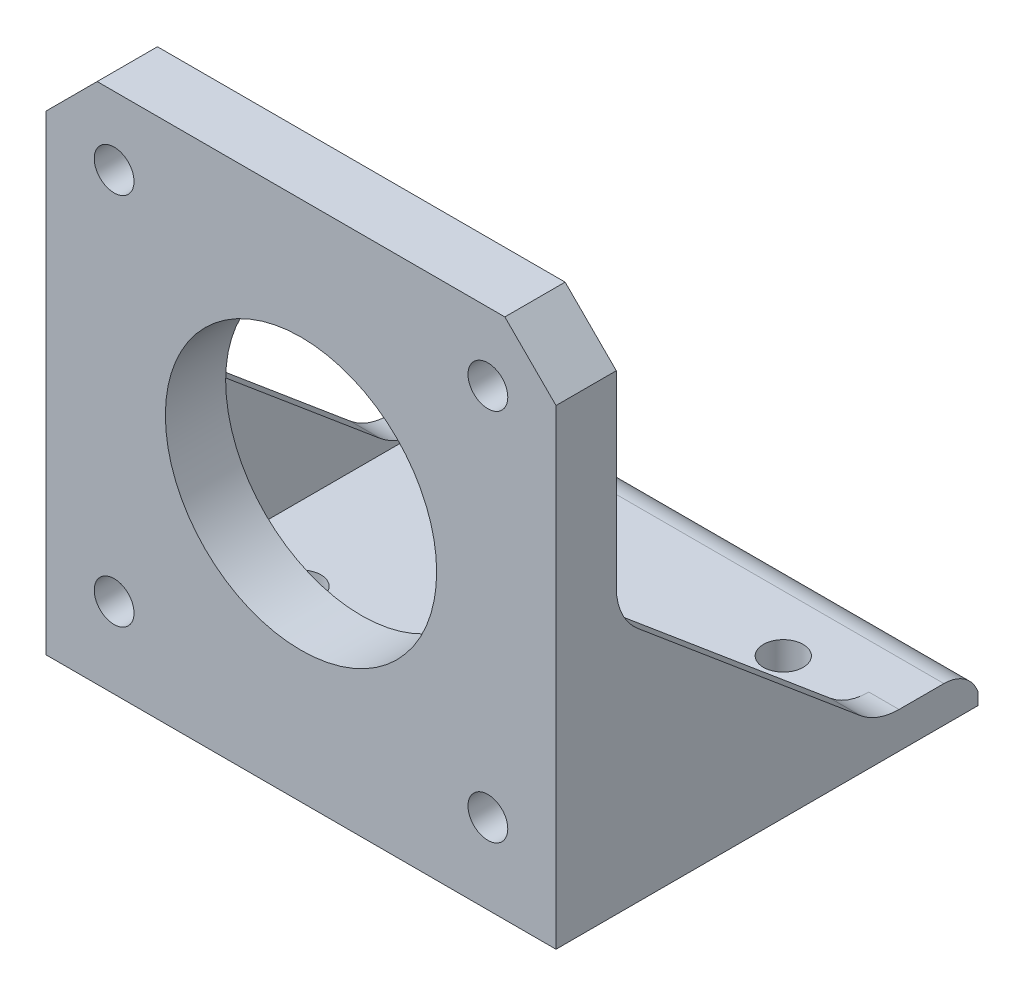
ISO-10303-21;
HEADER;
FILE_DESCRIPTION(('STEP AP214'),'2;1');
FILE_NAME('part.step','',(''),(''),'','','');
FILE_SCHEMA(('AUTOMOTIVE_DESIGN { 1 0 10303 214 1 1 1 1 }'));
ENDSEC;
DATA;
#1=APPLICATION_CONTEXT('core data for automotive mechanical design processes');
#2=APPLICATION_PROTOCOL_DEFINITION('international standard','automotive_design',2000,#1);
#3=PRODUCT_CONTEXT('',#1,'mechanical');
#4=PRODUCT('Part','Part','',(#3));
#5=PRODUCT_RELATED_PRODUCT_CATEGORY('part','',(#4));
#6=PRODUCT_DEFINITION_FORMATION('','',#4);
#7=PRODUCT_DEFINITION_CONTEXT('part definition',#1,'design');
#8=PRODUCT_DEFINITION('design','',#6,#7);
#9=PRODUCT_DEFINITION_SHAPE('','',#8);
#10=(LENGTH_UNIT() NAMED_UNIT(*) SI_UNIT(.MILLI.,.METRE.));
#11=(NAMED_UNIT(*) PLANE_ANGLE_UNIT() SI_UNIT($,.RADIAN.));
#12=(NAMED_UNIT(*) SI_UNIT($,.STERADIAN.) SOLID_ANGLE_UNIT());
#13=UNCERTAINTY_MEASURE_WITH_UNIT(LENGTH_MEASURE(1.E-05),#10,'distance_accuracy_value','');
#14=(GEOMETRIC_REPRESENTATION_CONTEXT(3) GLOBAL_UNCERTAINTY_ASSIGNED_CONTEXT((#13)) GLOBAL_UNIT_ASSIGNED_CONTEXT((#10,
#11,#12)) REPRESENTATION_CONTEXT('',''));
#15=CARTESIAN_POINT('',(0.,0.,0.));
#16=DIRECTION('',(0.,0.,1.));
#17=DIRECTION('',(1.,0.,0.));
#18=AXIS2_PLACEMENT_3D('',#15,#16,#17);
#19=CARTESIAN_POINT('',(0.,0.,-2.5));
#20=DIRECTION('',(0.,0.,-1.));
#21=DIRECTION('',(-1.,0.,0.));
#22=AXIS2_PLACEMENT_3D('',#19,#20,#21);
#23=PLANE('',#22);
#24=CARTESIAN_POINT('',(15.5,-15.5,-2.5));
#25=DIRECTION('',(0.,0.,1.));
#26=DIRECTION('',(1.,0.,0.));
#27=AXIS2_PLACEMENT_3D('',#24,#25,#26);
#28=CIRCLE('',#27,1.65);
#29=CARTESIAN_POINT('',(17.15,-15.5,-2.5));
#30=VERTEX_POINT('',#29);
#31=EDGE_CURVE('E242',#30,#30,#28,.T.);
#32=ORIENTED_EDGE('',*,*,#31,.T.);
#33=EDGE_LOOP('',(#32));
#34=FACE_BOUND('',#33,.T.);
#35=CARTESIAN_POINT('',(0.,0.,-2.5));
#36=DIRECTION('',(0.,0.,1.));
#37=DIRECTION('',(1.,0.,0.));
#38=AXIS2_PLACEMENT_3D('',#35,#36,#37);
#39=CIRCLE('',#38,11.25);
#40=CARTESIAN_POINT('',(11.25,0.,-2.5));
#41=VERTEX_POINT('',#40);
#42=EDGE_CURVE('E254',#41,#41,#39,.T.);
#43=ORIENTED_EDGE('',*,*,#42,.T.);
#44=EDGE_LOOP('',(#43));
#45=FACE_BOUND('',#44,.T.);
#46=CARTESIAN_POINT('',(-15.5,15.5,-2.5));
#47=DIRECTION('',(0.,0.,1.));
#48=DIRECTION('',(1.,0.,0.));
#49=AXIS2_PLACEMENT_3D('',#46,#47,#48);
#50=CIRCLE('',#49,1.65);
#51=CARTESIAN_POINT('',(-13.85,15.5,-2.5));
#52=VERTEX_POINT('',#51);
#53=EDGE_CURVE('E260',#52,#52,#50,.T.);
#54=ORIENTED_EDGE('',*,*,#53,.T.);
#55=EDGE_LOOP('',(#54));
#56=FACE_BOUND('',#55,.T.);
#57=CARTESIAN_POINT('',(15.5,15.5,-2.5));
#58=DIRECTION('',(0.,0.,1.));
#59=DIRECTION('',(1.,0.,0.));
#60=AXIS2_PLACEMENT_3D('',#57,#58,#59);
#61=CIRCLE('',#60,1.65);
#62=CARTESIAN_POINT('',(17.15,15.5,-2.5));
#63=VERTEX_POINT('',#62);
#64=EDGE_CURVE('E248',#63,#63,#61,.T.);
#65=ORIENTED_EDGE('',*,*,#64,.T.);
#66=EDGE_LOOP('',(#65));
#67=FACE_BOUND('',#66,.T.);
#68=CARTESIAN_POINT('',(-15.5,-15.5,-2.5));
#69=DIRECTION('',(0.,0.,1.));
#70=DIRECTION('',(1.,0.,0.));
#71=AXIS2_PLACEMENT_3D('',#68,#69,#70);
#72=CIRCLE('',#71,1.65);
#73=CARTESIAN_POINT('',(-13.85,-15.5,-2.5));
#74=VERTEX_POINT('',#73);
#75=EDGE_CURVE('E238',#74,#74,#72,.T.);
#76=ORIENTED_EDGE('',*,*,#75,.T.);
#77=EDGE_LOOP('',(#76));
#78=FACE_BOUND('',#77,.T.);
#79=DIRECTION('',(0.,-1.,0.));
#80=VECTOR('',#79,1.);
#81=CARTESIAN_POINT('',(-18.65,-0.999999999999998,-2.5));
#82=LINE('',#81,#80);
#83=CARTESIAN_POINT('',(-18.65,1.33153829077498,-2.5));
#84=VERTEX_POINT('',#83);
#85=CARTESIAN_POINT('',(-18.65,-19.1500000000001,-2.5));
#86=VERTEX_POINT('',#85);
#87=EDGE_CURVE('E212',#84,#86,#82,.T.);
#88=ORIENTED_EDGE('',*,*,#87,.F.);
#89=DIRECTION('',(-1.,0.,0.));
#90=VECTOR('',#89,1.);
#91=CARTESIAN_POINT('',(0.,1.33153829077498,-2.5));
#92=LINE('',#91,#90);
#93=CARTESIAN_POINT('',(-21.1500000000001,1.33153829077498,-2.5));
#94=VERTEX_POINT('',#93);
#95=EDGE_CURVE('E315',#84,#94,#92,.T.);
#96=ORIENTED_EDGE('',*,*,#95,.T.);
#97=DIRECTION('',(0.,-1.,0.));
#98=VECTOR('',#97,1.);
#99=CARTESIAN_POINT('',(-21.1500000000001,-16.9073593128808,-2.5));
#100=LINE('',#99,#98);
#101=CARTESIAN_POINT('',(-21.15,16.9073593128807,-2.5));
#102=VERTEX_POINT('',#101);
#103=EDGE_CURVE('E266',#102,#94,#100,.T.);
#104=ORIENTED_EDGE('',*,*,#103,.F.);
#105=DIRECTION('',(-0.707106781186546,-0.707106781186549,0.));
#106=VECTOR('',#105,1.);
#107=CARTESIAN_POINT('',(-21.15,16.9073593128807,-2.5));
#108=LINE('',#107,#106);
#109=CARTESIAN_POINT('',(-16.9073593128807,21.15,-2.5));
#110=VERTEX_POINT('',#109);
#111=EDGE_CURVE('E170',#110,#102,#108,.T.);
#112=ORIENTED_EDGE('',*,*,#111,.F.);
#113=DIRECTION('',(-1.,0.,0.));
#114=VECTOR('',#113,1.);
#115=CARTESIAN_POINT('',(-16.9073593128807,21.15,-2.5));
#116=LINE('',#115,#114);
#117=CARTESIAN_POINT('',(16.9073593128808,21.15,-2.5));
#118=VERTEX_POINT('',#117);
#119=EDGE_CURVE('E282',#118,#110,#116,.T.);
#120=ORIENTED_EDGE('',*,*,#119,.F.);
#121=DIRECTION('',(-0.707106781186549,0.707106781186546,0.));
#122=VECTOR('',#121,1.);
#123=CARTESIAN_POINT('',(16.9073593128808,21.15,-2.5));
#124=LINE('',#123,#122);
#125=CARTESIAN_POINT('',(21.15,16.9073593128808,-2.5));
#126=VERTEX_POINT('',#125);
#127=EDGE_CURVE('E280',#126,#118,#124,.T.);
#128=ORIENTED_EDGE('',*,*,#127,.F.);
#129=DIRECTION('',(0.,1.,0.));
#130=VECTOR('',#129,1.);
#131=CARTESIAN_POINT('',(21.15,16.9073593128808,-2.5));
#132=LINE('',#131,#130);
#133=CARTESIAN_POINT('',(21.15,1.33153829077498,-2.5));
#134=VERTEX_POINT('',#133);
#135=EDGE_CURVE('E278',#134,#126,#132,.T.);
#136=ORIENTED_EDGE('',*,*,#135,.F.);
#137=DIRECTION('',(1.,0.,0.));
#138=VECTOR('',#137,1.);
#139=CARTESIAN_POINT('',(18.65,1.33153829077498,-2.5));
#140=LINE('',#139,#138);
#141=CARTESIAN_POINT('',(18.65,1.33153829077498,-2.5));
#142=VERTEX_POINT('',#141);
#143=EDGE_CURVE('E312',#134,#142,#140,.F.);
#144=ORIENTED_EDGE('',*,*,#143,.T.);
#145=DIRECTION('',(0.,-1.,0.));
#146=VECTOR('',#145,1.);
#147=CARTESIAN_POINT('',(18.65,-0.999999999999998,-2.5));
#148=LINE('',#147,#146);
#149=CARTESIAN_POINT('',(18.65,-19.1500000000001,-2.5));
#150=VERTEX_POINT('',#149);
#151=EDGE_CURVE('E225',#142,#150,#148,.T.);
#152=ORIENTED_EDGE('',*,*,#151,.T.);
#153=DIRECTION('',(1.,0.,0.));
#154=VECTOR('',#153,1.);
#155=CARTESIAN_POINT('',(0.,-19.1500000000001,-2.5));
#156=LINE('',#155,#154);
#157=EDGE_CURVE('E235',#86,#150,#156,.T.);
#158=ORIENTED_EDGE('',*,*,#157,.F.);
#159=EDGE_LOOP('',(#88,#96,#104,#112,#120,#128,#136,#144,#152,#158));
#160=FACE_BOUND('',#159,.T.);
#161=ADVANCED_FACE('F38',(#34,#45,#56,#67,#78,#160),#23,.T.);
#162=CARTESIAN_POINT('',(0.,-19.1500000000001,0.));
#163=DIRECTION('',(0.,1.,0.));
#164=DIRECTION('',(0.,0.,1.));
#165=AXIS2_PLACEMENT_3D('',#162,#163,#164);
#166=PLANE('',#165);
#167=CARTESIAN_POINT('',(-12.5,-19.1500000000001,-10.));
#168=DIRECTION('',(0.,1.,0.));
#169=DIRECTION('',(0.,0.,-1.));
#170=AXIS2_PLACEMENT_3D('',#167,#168,#169);
#171=CIRCLE('',#170,1.65);
#172=CARTESIAN_POINT('',(-12.5,-19.1500000000001,-11.65));
#173=VERTEX_POINT('',#172);
#174=EDGE_CURVE('E197',#173,#173,#171,.T.);
#175=ORIENTED_EDGE('',*,*,#174,.F.);
#176=EDGE_LOOP('',(#175));
#177=FACE_BOUND('',#176,.T.);
#178=CARTESIAN_POINT('',(-12.5,-19.1500000000001,-25.));
#179=DIRECTION('',(0.,1.,0.));
#180=DIRECTION('',(0.,0.,-1.));
#181=AXIS2_PLACEMENT_3D('',#178,#179,#180);
#182=CIRCLE('',#181,1.65);
#183=CARTESIAN_POINT('',(-12.5,-19.1500000000001,-26.65));
#184=VERTEX_POINT('',#183);
#185=EDGE_CURVE('E202',#184,#184,#182,.T.);
#186=ORIENTED_EDGE('',*,*,#185,.F.);
#187=EDGE_LOOP('',(#186));
#188=FACE_BOUND('',#187,.T.);
#189=CARTESIAN_POINT('',(12.5,-19.1500000000001,-25.));
#190=DIRECTION('',(0.,1.,0.));
#191=DIRECTION('',(0.,0.,1.));
#192=AXIS2_PLACEMENT_3D('',#189,#190,#191);
#193=CIRCLE('',#192,1.65);
#194=CARTESIAN_POINT('',(12.5,-19.1500000000001,-23.35));
#195=VERTEX_POINT('',#194);
#196=EDGE_CURVE('E198',#195,#195,#193,.T.);
#197=ORIENTED_EDGE('',*,*,#196,.F.);
#198=EDGE_LOOP('',(#197));
#199=FACE_BOUND('',#198,.T.);
#200=CARTESIAN_POINT('',(12.5,-19.1500000000001,-10.));
#201=DIRECTION('',(0.,1.,0.));
#202=DIRECTION('',(0.,0.,1.));
#203=AXIS2_PLACEMENT_3D('',#200,#201,#202);
#204=CIRCLE('',#203,1.65);
#205=CARTESIAN_POINT('',(12.5,-19.1500000000001,-8.35));
#206=VERTEX_POINT('',#205);
#207=EDGE_CURVE('E201',#206,#206,#204,.T.);
#208=ORIENTED_EDGE('',*,*,#207,.F.);
#209=EDGE_LOOP('',(#208));
#210=FACE_BOUND('',#209,.T.);
#211=DIRECTION('',(0.,0.,1.));
#212=VECTOR('',#211,1.);
#213=CARTESIAN_POINT('',(21.15,-19.1500000000001,2.5));
#214=LINE('',#213,#212);
#215=CARTESIAN_POINT('',(21.15,-19.1500000000001,-29.6715728752538));
#216=VERTEX_POINT('',#215);
#217=CARTESIAN_POINT('',(21.15,-19.1500000000001,-25.9501788769158));
#218=VERTEX_POINT('',#217);
#219=EDGE_CURVE('E231',#216,#218,#214,.T.);
#220=ORIENTED_EDGE('',*,*,#219,.F.);
#221=DIRECTION('',(-1.,0.,0.));
#222=VECTOR('',#221,1.);
#223=CARTESIAN_POINT('',(-21.1500000000001,-19.1500000000001,-29.6715728752538));
#224=LINE('',#223,#222);
#225=CARTESIAN_POINT('',(-21.1500000000001,-19.1500000000001,-29.6715728752538));
#226=VERTEX_POINT('',#225);
#227=EDGE_CURVE('E46',#216,#226,#224,.T.);
#228=ORIENTED_EDGE('',*,*,#227,.T.);
#229=DIRECTION('',(0.,0.,-1.));
#230=VECTOR('',#229,1.);
#231=CARTESIAN_POINT('',(-21.1500000000001,-19.1500000000001,2.49999999999999));
#232=LINE('',#231,#230);
#233=CARTESIAN_POINT('',(-21.1500000000001,-19.1500000000001,-25.9501788769158));
#234=VERTEX_POINT('',#233);
#235=EDGE_CURVE('E233',#234,#226,#232,.T.);
#236=ORIENTED_EDGE('',*,*,#235,.F.);
#237=DIRECTION('',(-1.,0.,0.));
#238=VECTOR('',#237,1.);
#239=CARTESIAN_POINT('',(0.,-19.1500000000001,-25.9501788769158));
#240=LINE('',#239,#238);
#241=CARTESIAN_POINT('',(-18.65,-19.1500000000001,-25.9501788769158));
#242=VERTEX_POINT('',#241);
#243=EDGE_CURVE('E296',#234,#242,#240,.F.);
#244=ORIENTED_EDGE('',*,*,#243,.T.);
#245=DIRECTION('',(0.,0.,-1.));
#246=VECTOR('',#245,1.);
#247=CARTESIAN_POINT('',(-18.65,-19.1500000000001,-2.5));
#248=LINE('',#247,#246);
#249=EDGE_CURVE('E210',#86,#242,#248,.T.);
#250=ORIENTED_EDGE('',*,*,#249,.F.);
#251=ORIENTED_EDGE('',*,*,#157,.T.);
#252=DIRECTION('',(0.,0.,-1.));
#253=VECTOR('',#252,1.);
#254=CARTESIAN_POINT('',(18.65,-19.1500000000001,-2.5));
#255=LINE('',#254,#253);
#256=CARTESIAN_POINT('',(18.65,-19.1500000000001,-25.9501788769158));
#257=VERTEX_POINT('',#256);
#258=EDGE_CURVE('E220',#150,#257,#255,.T.);
#259=ORIENTED_EDGE('',*,*,#258,.T.);
#260=DIRECTION('',(1.,0.,0.));
#261=VECTOR('',#260,1.);
#262=CARTESIAN_POINT('',(21.15,-19.1500000000001,-25.9501788769158));
#263=LINE('',#262,#261);
#264=EDGE_CURVE('E299',#257,#218,#263,.T.);
#265=ORIENTED_EDGE('',*,*,#264,.T.);
#266=EDGE_LOOP('',(#220,#228,#236,#244,#250,#251,#259,#265));
#267=FACE_BOUND('',#266,.T.);
#268=ADVANCED_FACE('F372',(#177,#188,#199,#210,#267),#166,.T.);
#269=CARTESIAN_POINT('',(0.,0.,2.5));
#270=DIRECTION('',(0.,0.,-1.));
#271=DIRECTION('',(-1.,0.,0.));
#272=AXIS2_PLACEMENT_3D('',#269,#270,#271);
#273=PLANE('',#272);
#274=DIRECTION('',(0.,-1.,0.));
#275=VECTOR('',#274,1.);
#276=CARTESIAN_POINT('',(-21.1500000000001,-16.9073593128808,2.5));
#277=LINE('',#276,#275);
#278=CARTESIAN_POINT('',(-21.15,16.9073593128807,2.5));
#279=VERTEX_POINT('',#278);
#280=CARTESIAN_POINT('',(-21.1500000000001,-22.1500000000001,2.5));
#281=VERTEX_POINT('',#280);
#282=EDGE_CURVE('E158',#279,#281,#277,.T.);
#283=ORIENTED_EDGE('',*,*,#282,.T.);
#284=DIRECTION('',(-1.,0.,0.));
#285=VECTOR('',#284,1.);
#286=CARTESIAN_POINT('',(21.15,-22.1500000000001,2.5));
#287=LINE('',#286,#285);
#288=CARTESIAN_POINT('',(21.15,-22.1500000000001,2.5));
#289=VERTEX_POINT('',#288);
#290=EDGE_CURVE('E163',#289,#281,#287,.T.);
#291=ORIENTED_EDGE('',*,*,#290,.F.);
#292=DIRECTION('',(0.,1.,0.));
#293=VECTOR('',#292,1.);
#294=CARTESIAN_POINT('',(21.15,-21.1500000000001,2.5));
#295=LINE('',#294,#293);
#296=CARTESIAN_POINT('',(21.15,16.9073593128808,2.5));
#297=VERTEX_POINT('',#296);
#298=EDGE_CURVE('E169',#289,#297,#295,.T.);
#299=ORIENTED_EDGE('',*,*,#298,.T.);
#300=DIRECTION('',(-0.707106781186549,0.707106781186546,0.));
#301=VECTOR('',#300,1.);
#302=CARTESIAN_POINT('',(16.9073593128808,21.15,2.5));
#303=LINE('',#302,#301);
#304=CARTESIAN_POINT('',(16.9073593128808,21.15,2.5));
#305=VERTEX_POINT('',#304);
#306=EDGE_CURVE('E270',#297,#305,#303,.T.);
#307=ORIENTED_EDGE('',*,*,#306,.T.);
#308=DIRECTION('',(-1.,0.,0.));
#309=VECTOR('',#308,1.);
#310=CARTESIAN_POINT('',(-16.9073593128807,21.15,2.5));
#311=LINE('',#310,#309);
#312=CARTESIAN_POINT('',(-16.9073593128807,21.15,2.5));
#313=VERTEX_POINT('',#312);
#314=EDGE_CURVE('E272',#305,#313,#311,.T.);
#315=ORIENTED_EDGE('',*,*,#314,.T.);
#316=DIRECTION('',(-0.707106781186546,-0.707106781186549,0.));
#317=VECTOR('',#316,1.);
#318=CARTESIAN_POINT('',(-21.15,16.9073593128807,2.5));
#319=LINE('',#318,#317);
#320=EDGE_CURVE('E165',#313,#279,#319,.T.);
#321=ORIENTED_EDGE('',*,*,#320,.T.);
#322=EDGE_LOOP('',(#283,#291,#299,#307,#315,#321));
#323=FACE_BOUND('',#322,.T.);
#324=CARTESIAN_POINT('',(-15.5,15.5,2.5));
#325=DIRECTION('',(0.,0.,1.));
#326=DIRECTION('',(1.,0.,0.));
#327=AXIS2_PLACEMENT_3D('',#324,#325,#326);
#328=CIRCLE('',#327,1.65);
#329=CARTESIAN_POINT('',(-13.85,15.5,2.5));
#330=VERTEX_POINT('',#329);
#331=EDGE_CURVE('E263',#330,#330,#328,.T.);
#332=ORIENTED_EDGE('',*,*,#331,.F.);
#333=EDGE_LOOP('',(#332));
#334=FACE_BOUND('',#333,.T.);
#335=CARTESIAN_POINT('',(0.,0.,2.5));
#336=DIRECTION('',(0.,0.,1.));
#337=DIRECTION('',(1.,0.,0.));
#338=AXIS2_PLACEMENT_3D('',#335,#336,#337);
#339=CIRCLE('',#338,11.25);
#340=CARTESIAN_POINT('',(11.25,0.,2.5));
#341=VERTEX_POINT('',#340);
#342=EDGE_CURVE('E257',#341,#341,#339,.T.);
#343=ORIENTED_EDGE('',*,*,#342,.F.);
#344=EDGE_LOOP('',(#343));
#345=FACE_BOUND('',#344,.T.);
#346=CARTESIAN_POINT('',(15.5,15.5,2.5));
#347=DIRECTION('',(0.,0.,1.));
#348=DIRECTION('',(1.,0.,0.));
#349=AXIS2_PLACEMENT_3D('',#346,#347,#348);
#350=CIRCLE('',#349,1.65);
#351=CARTESIAN_POINT('',(17.15,15.5,2.5));
#352=VERTEX_POINT('',#351);
#353=EDGE_CURVE('E251',#352,#352,#350,.T.);
#354=ORIENTED_EDGE('',*,*,#353,.F.);
#355=EDGE_LOOP('',(#354));
#356=FACE_BOUND('',#355,.T.);
#357=CARTESIAN_POINT('',(15.5,-15.5,2.5));
#358=DIRECTION('',(0.,0.,1.));
#359=DIRECTION('',(1.,0.,0.));
#360=AXIS2_PLACEMENT_3D('',#357,#358,#359);
#361=CIRCLE('',#360,1.65);
#362=CARTESIAN_POINT('',(17.15,-15.5,2.5));
#363=VERTEX_POINT('',#362);
#364=EDGE_CURVE('E245',#363,#363,#361,.T.);
#365=ORIENTED_EDGE('',*,*,#364,.F.);
#366=EDGE_LOOP('',(#365));
#367=FACE_BOUND('',#366,.T.);
#368=CARTESIAN_POINT('',(-15.5,-15.5,2.5));
#369=DIRECTION('',(0.,0.,1.));
#370=DIRECTION('',(1.,0.,0.));
#371=AXIS2_PLACEMENT_3D('',#368,#369,#370);
#372=CIRCLE('',#371,1.65);
#373=CARTESIAN_POINT('',(-13.85,-15.5,2.5));
#374=VERTEX_POINT('',#373);
#375=EDGE_CURVE('E239',#374,#374,#372,.T.);
#376=ORIENTED_EDGE('',*,*,#375,.F.);
#377=EDGE_LOOP('',(#376));
#378=FACE_BOUND('',#377,.T.);
#379=ADVANCED_FACE('F160',(#323,#334,#345,#356,#367,#378),#273,.F.);
#380=CARTESIAN_POINT('',(-21.1500000000001,-16.9073593128808,2.5));
#381=DIRECTION('',(1.,0.,0.));
#382=DIRECTION('',(0.,0.,-1.));
#383=AXIS2_PLACEMENT_3D('',#380,#381,#382);
#384=PLANE('',#383);
#385=ORIENTED_EDGE('',*,*,#235,.T.);
#386=CARTESIAN_POINT('',(-21.1500000000001,-22.1500000000001,-29.6715728752538));
#387=DIRECTION('',(1.,0.,0.));
#388=DIRECTION('',(0.,0.,-1.));
#389=AXIS2_PLACEMENT_3D('',#386,#387,#388);
#390=CIRCLE('',#389,3.);
#391=CARTESIAN_POINT('',(-21.1500000000001,-21.1500000000001,-32.5));
#392=VERTEX_POINT('',#391);
#393=EDGE_CURVE('E11',#226,#392,#390,.F.);
#394=ORIENTED_EDGE('',*,*,#393,.T.);
#395=DIRECTION('',(0.,1.,0.));
#396=VECTOR('',#395,1.);
#397=CARTESIAN_POINT('',(-21.1500000000001,-22.1500000000001,-32.5));
#398=LINE('',#397,#396);
#399=CARTESIAN_POINT('',(-21.1500000000001,-22.1500000000001,-32.5));
#400=VERTEX_POINT('',#399);
#401=EDGE_CURVE('E175',#400,#392,#398,.T.);
#402=ORIENTED_EDGE('',*,*,#401,.F.);
#403=DIRECTION('',(0.,0.,-1.));
#404=VECTOR('',#403,1.);
#405=CARTESIAN_POINT('',(-21.1500000000001,-22.1500000000001,2.5));
#406=LINE('',#405,#404);
#407=EDGE_CURVE('E173',#281,#400,#406,.T.);
#408=ORIENTED_EDGE('',*,*,#407,.F.);
#409=ORIENTED_EDGE('',*,*,#282,.F.);
#410=DIRECTION('',(0.,0.,-1.));
#411=VECTOR('',#410,1.);
#412=CARTESIAN_POINT('',(-21.15,16.9073593128807,2.5));
#413=LINE('',#412,#411);
#414=EDGE_CURVE('E275',#279,#102,#413,.T.);
#415=ORIENTED_EDGE('',*,*,#414,.T.);
#416=ORIENTED_EDGE('',*,*,#103,.T.);
#417=CARTESIAN_POINT('',(-21.1500000000001,1.33153829077498,-7.5));
#418=DIRECTION('',(1.,0.,0.));
#419=DIRECTION('',(0.,0.,-1.));
#420=AXIS2_PLACEMENT_3D('',#417,#418,#419);
#421=CIRCLE('',#420,5.);
#422=CARTESIAN_POINT('',(-21.15,-2.49868392481989,-4.28606195156728));
#423=VERTEX_POINT('',#422);
#424=EDGE_CURVE('E327',#94,#423,#421,.T.);
#425=ORIENTED_EDGE('',*,*,#424,.T.);
#426=DIRECTION('',(0.,0.642787609686543,0.766044443118975));
#427=VECTOR('',#426,1.);
#428=CARTESIAN_POINT('',(-21.15,-19.1500000000001,-24.1303277055848));
#429=LINE('',#428,#427);
#430=CARTESIAN_POINT('',(-21.15,-17.980222215595,-22.7362408284831));
#431=VERTEX_POINT('',#430);
#432=EDGE_CURVE('E209',#431,#423,#429,.T.);
#433=ORIENTED_EDGE('',*,*,#432,.F.);
#434=CARTESIAN_POINT('',(-21.1500000000001,-14.1500000000001,-25.9501788769158));
#435=DIRECTION('',(1.,0.,0.));
#436=DIRECTION('',(0.,0.,-1.));
#437=AXIS2_PLACEMENT_3D('',#434,#435,#436);
#438=CIRCLE('',#437,5.);
#439=EDGE_CURVE('E323',#431,#234,#438,.T.);
#440=ORIENTED_EDGE('',*,*,#439,.T.);
#441=EDGE_LOOP('',(#385,#394,#402,#408,#409,#415,#416,#425,#433,#440));
#442=FACE_BOUND('',#441,.T.);
#443=ADVANCED_FACE('F174',(#442),#384,.F.);
#444=CARTESIAN_POINT('',(21.15,16.9073593128808,2.5));
#445=DIRECTION('',(-1.,0.,0.));
#446=DIRECTION('',(0.,-1.,0.));
#447=AXIS2_PLACEMENT_3D('',#444,#445,#446);
#448=PLANE('',#447);
#449=ORIENTED_EDGE('',*,*,#298,.F.);
#450=DIRECTION('',(0.,0.,1.));
#451=VECTOR('',#450,1.);
#452=CARTESIAN_POINT('',(21.15,-22.1500000000001,-32.5));
#453=LINE('',#452,#451);
#454=CARTESIAN_POINT('',(21.15,-22.1500000000001,-32.5));
#455=VERTEX_POINT('',#454);
#456=EDGE_CURVE('E184',#455,#289,#453,.T.);
#457=ORIENTED_EDGE('',*,*,#456,.F.);
#458=DIRECTION('',(0.,1.,0.));
#459=VECTOR('',#458,1.);
#460=CARTESIAN_POINT('',(21.15,-22.1500000000001,-32.5));
#461=LINE('',#460,#459);
#462=CARTESIAN_POINT('',(21.15,-21.1500000000001,-32.5));
#463=VERTEX_POINT('',#462);
#464=EDGE_CURVE('E194',#455,#463,#461,.T.);
#465=ORIENTED_EDGE('',*,*,#464,.T.);
#466=CARTESIAN_POINT('',(21.15,-22.1500000000001,-29.6715728752538));
#467=DIRECTION('',(-1.,0.,0.));
#468=DIRECTION('',(0.,-1.,0.));
#469=AXIS2_PLACEMENT_3D('',#466,#467,#468);
#470=CIRCLE('',#469,3.);
#471=EDGE_CURVE('E60',#463,#216,#470,.F.);
#472=ORIENTED_EDGE('',*,*,#471,.T.);
#473=ORIENTED_EDGE('',*,*,#219,.T.);
#474=CARTESIAN_POINT('',(21.15,-14.1500000000001,-25.9501788769158));
#475=DIRECTION('',(-1.,0.,0.));
#476=DIRECTION('',(0.,-1.,0.));
#477=AXIS2_PLACEMENT_3D('',#474,#475,#476);
#478=CIRCLE('',#477,5.);
#479=CARTESIAN_POINT('',(21.15,-17.980222215595,-22.7362408284831));
#480=VERTEX_POINT('',#479);
#481=EDGE_CURVE('E318',#218,#480,#478,.T.);
#482=ORIENTED_EDGE('',*,*,#481,.T.);
#483=DIRECTION('',(0.,0.642787609686543,0.766044443118975));
#484=VECTOR('',#483,1.);
#485=CARTESIAN_POINT('',(21.15,-19.1500000000001,-24.1303277055848));
#486=LINE('',#485,#484);
#487=CARTESIAN_POINT('',(21.15,-2.49868392481989,-4.28606195156728));
#488=VERTEX_POINT('',#487);
#489=EDGE_CURVE('E217',#480,#488,#486,.T.);
#490=ORIENTED_EDGE('',*,*,#489,.T.);
#491=CARTESIAN_POINT('',(21.15,1.33153829077498,-7.5));
#492=DIRECTION('',(-1.,0.,0.));
#493=DIRECTION('',(0.,-1.,0.));
#494=AXIS2_PLACEMENT_3D('',#491,#492,#493);
#495=CIRCLE('',#494,5.);
#496=EDGE_CURVE('E332',#488,#134,#495,.T.);
#497=ORIENTED_EDGE('',*,*,#496,.T.);
#498=ORIENTED_EDGE('',*,*,#135,.T.);
#499=DIRECTION('',(0.,0.,-1.));
#500=VECTOR('',#499,1.);
#501=CARTESIAN_POINT('',(21.15,16.9073593128808,2.5));
#502=LINE('',#501,#500);
#503=EDGE_CURVE('E293',#297,#126,#502,.T.);
#504=ORIENTED_EDGE('',*,*,#503,.F.);
#505=EDGE_LOOP('',(#449,#457,#465,#472,#473,#482,#490,#497,#498,#504));
#506=FACE_BOUND('',#505,.T.);
#507=ADVANCED_FACE('F351',(#506),#448,.F.);
#508=CARTESIAN_POINT('',(16.9073593128808,21.15,2.5));
#509=DIRECTION('',(-0.707106781186546,-0.707106781186549,0.));
#510=DIRECTION('',(0.707106781186549,-0.707106781186546,0.));
#511=AXIS2_PLACEMENT_3D('',#508,#509,#510);
#512=PLANE('',#511);
#513=ORIENTED_EDGE('',*,*,#127,.T.);
#514=DIRECTION('',(0.,0.,-1.));
#515=VECTOR('',#514,1.);
#516=CARTESIAN_POINT('',(16.9073593128808,21.15,2.5));
#517=LINE('',#516,#515);
#518=EDGE_CURVE('E290',#305,#118,#517,.T.);
#519=ORIENTED_EDGE('',*,*,#518,.F.);
#520=ORIENTED_EDGE('',*,*,#306,.F.);
#521=ORIENTED_EDGE('',*,*,#503,.T.);
#522=EDGE_LOOP('',(#513,#519,#520,#521));
#523=FACE_BOUND('',#522,.T.);
#524=ADVANCED_FACE('F359',(#523),#512,.F.);
#525=CARTESIAN_POINT('',(-16.9073593128807,21.15,2.5));
#526=DIRECTION('',(0.,-1.,0.));
#527=DIRECTION('',(1.,0.,0.));
#528=AXIS2_PLACEMENT_3D('',#525,#526,#527);
#529=PLANE('',#528);
#530=ORIENTED_EDGE('',*,*,#119,.T.);
#531=DIRECTION('',(0.,0.,-1.));
#532=VECTOR('',#531,1.);
#533=CARTESIAN_POINT('',(-16.9073593128807,21.15,2.5));
#534=LINE('',#533,#532);
#535=EDGE_CURVE('E287',#313,#110,#534,.T.);
#536=ORIENTED_EDGE('',*,*,#535,.F.);
#537=ORIENTED_EDGE('',*,*,#314,.F.);
#538=ORIENTED_EDGE('',*,*,#518,.T.);
#539=EDGE_LOOP('',(#530,#536,#537,#538));
#540=FACE_BOUND('',#539,.T.);
#541=ADVANCED_FACE('F363',(#540),#529,.F.);
#542=CARTESIAN_POINT('',(-21.15,16.9073593128807,2.5));
#543=DIRECTION('',(0.707106781186549,-0.707106781186546,0.));
#544=DIRECTION('',(0.707106781186546,0.707106781186549,0.));
#545=AXIS2_PLACEMENT_3D('',#542,#543,#544);
#546=PLANE('',#545);
#547=ORIENTED_EDGE('',*,*,#111,.T.);
#548=ORIENTED_EDGE('',*,*,#414,.F.);
#549=ORIENTED_EDGE('',*,*,#320,.F.);
#550=ORIENTED_EDGE('',*,*,#535,.T.);
#551=EDGE_LOOP('',(#547,#548,#549,#550));
#552=FACE_BOUND('',#551,.T.);
#553=ADVANCED_FACE('F414',(#552),#546,.F.);
#554=CARTESIAN_POINT('',(-15.5,15.5,2.5));
#555=DIRECTION('',(0.,0.,-1.));
#556=DIRECTION('',(-1.,0.,0.));
#557=AXIS2_PLACEMENT_3D('',#554,#555,#556);
#558=CYLINDRICAL_SURFACE('',#557,1.65);
#559=ORIENTED_EDGE('',*,*,#331,.T.);
#560=EDGE_LOOP('',(#559));
#561=FACE_BOUND('',#560,.T.);
#562=ORIENTED_EDGE('',*,*,#53,.F.);
#563=EDGE_LOOP('',(#562));
#564=FACE_BOUND('',#563,.T.);
#565=ADVANCED_FACE('F417',(#561,#564),#558,.F.);
#566=CARTESIAN_POINT('',(0.,0.,2.5));
#567=DIRECTION('',(0.,0.,-1.));
#568=DIRECTION('',(-1.,0.,0.));
#569=AXIS2_PLACEMENT_3D('',#566,#567,#568);
#570=CYLINDRICAL_SURFACE('',#569,11.25);
#571=ORIENTED_EDGE('',*,*,#342,.T.);
#572=EDGE_LOOP('',(#571));
#573=FACE_BOUND('',#572,.T.);
#574=ORIENTED_EDGE('',*,*,#42,.F.);
#575=EDGE_LOOP('',(#574));
#576=FACE_BOUND('',#575,.T.);
#577=ADVANCED_FACE('F528',(#573,#576),#570,.F.);
#578=CARTESIAN_POINT('',(15.5,15.5,2.5));
#579=DIRECTION('',(0.,0.,-1.));
#580=DIRECTION('',(-1.,0.,0.));
#581=AXIS2_PLACEMENT_3D('',#578,#579,#580);
#582=CYLINDRICAL_SURFACE('',#581,1.65);
#583=ORIENTED_EDGE('',*,*,#353,.T.);
#584=EDGE_LOOP('',(#583));
#585=FACE_BOUND('',#584,.T.);
#586=ORIENTED_EDGE('',*,*,#64,.F.);
#587=EDGE_LOOP('',(#586));
#588=FACE_BOUND('',#587,.T.);
#589=ADVANCED_FACE('F518',(#585,#588),#582,.F.);
#590=CARTESIAN_POINT('',(15.5,-15.5,2.5));
#591=DIRECTION('',(0.,0.,-1.));
#592=DIRECTION('',(-1.,0.,0.));
#593=AXIS2_PLACEMENT_3D('',#590,#591,#592);
#594=CYLINDRICAL_SURFACE('',#593,1.65);
#595=ORIENTED_EDGE('',*,*,#364,.T.);
#596=EDGE_LOOP('',(#595));
#597=FACE_BOUND('',#596,.T.);
#598=ORIENTED_EDGE('',*,*,#31,.F.);
#599=EDGE_LOOP('',(#598));
#600=FACE_BOUND('',#599,.T.);
#601=ADVANCED_FACE('F507',(#597,#600),#594,.F.);
#602=CARTESIAN_POINT('',(-15.5,-15.5,2.5));
#603=DIRECTION('',(0.,0.,-1.));
#604=DIRECTION('',(-1.,0.,0.));
#605=AXIS2_PLACEMENT_3D('',#602,#603,#604);
#606=CYLINDRICAL_SURFACE('',#605,1.65);
#607=ORIENTED_EDGE('',*,*,#375,.T.);
#608=EDGE_LOOP('',(#607));
#609=FACE_BOUND('',#608,.T.);
#610=ORIENTED_EDGE('',*,*,#75,.F.);
#611=EDGE_LOOP('',(#610));
#612=FACE_BOUND('',#611,.T.);
#613=ADVANCED_FACE('F493',(#609,#612),#606,.F.);
#614=CARTESIAN_POINT('',(18.65,-19.1500000000001,-24.1303277055848));
#615=DIRECTION('',(0.,0.766044443118975,-0.642787609686543));
#616=DIRECTION('',(0.,0.642787609686543,0.766044443118975));
#617=AXIS2_PLACEMENT_3D('',#614,#615,#616);
#618=PLANE('',#617);
#619=ORIENTED_EDGE('',*,*,#489,.F.);
#620=DIRECTION('',(1.,0.,0.));
#621=VECTOR('',#620,1.);
#622=CARTESIAN_POINT('',(18.65,-17.980222215595,-22.7362408284831));
#623=LINE('',#622,#621);
#624=CARTESIAN_POINT('',(18.65,-17.980222215595,-22.7362408284831));
#625=VERTEX_POINT('',#624);
#626=EDGE_CURVE('E305',#480,#625,#623,.F.);
#627=ORIENTED_EDGE('',*,*,#626,.T.);
#628=DIRECTION('',(0.,0.642787609686543,0.766044443118975));
#629=VECTOR('',#628,1.);
#630=CARTESIAN_POINT('',(18.65,-19.1500000000001,-24.1303277055848));
#631=LINE('',#630,#629);
#632=CARTESIAN_POINT('',(18.65,-2.49868392481989,-4.28606195156728));
#633=VERTEX_POINT('',#632);
#634=EDGE_CURVE('E222',#625,#633,#631,.T.);
#635=ORIENTED_EDGE('',*,*,#634,.T.);
#636=DIRECTION('',(1.,0.,0.));
#637=VECTOR('',#636,1.);
#638=CARTESIAN_POINT('',(21.15,-2.49868392481989,-4.28606195156728));
#639=LINE('',#638,#637);
#640=EDGE_CURVE('E302',#633,#488,#639,.T.);
#641=ORIENTED_EDGE('',*,*,#640,.T.);
#642=EDGE_LOOP('',(#619,#627,#635,#641));
#643=FACE_BOUND('',#642,.T.);
#644=ADVANCED_FACE('F347',(#643),#618,.T.);
#645=CARTESIAN_POINT('',(18.65,0.,0.));
#646=DIRECTION('',(-1.,0.,0.));
#647=DIRECTION('',(0.,-1.,0.));
#648=AXIS2_PLACEMENT_3D('',#645,#646,#647);
#649=PLANE('',#648);
#650=ORIENTED_EDGE('',*,*,#258,.F.);
#651=ORIENTED_EDGE('',*,*,#151,.F.);
#652=CARTESIAN_POINT('',(18.65,1.33153829077498,-7.5));
#653=DIRECTION('',(-1.,0.,0.));
#654=DIRECTION('',(0.,-1.,0.));
#655=AXIS2_PLACEMENT_3D('',#652,#653,#654);
#656=CIRCLE('',#655,5.);
#657=EDGE_CURVE('E334',#142,#633,#656,.F.);
#658=ORIENTED_EDGE('',*,*,#657,.T.);
#659=ORIENTED_EDGE('',*,*,#634,.F.);
#660=CARTESIAN_POINT('',(18.65,-14.1500000000001,-25.9501788769158));
#661=DIRECTION('',(-1.,0.,0.));
#662=DIRECTION('',(0.,-1.,0.));
#663=AXIS2_PLACEMENT_3D('',#660,#661,#662);
#664=CIRCLE('',#663,5.);
#665=EDGE_CURVE('E320',#625,#257,#664,.F.);
#666=ORIENTED_EDGE('',*,*,#665,.T.);
#667=EDGE_LOOP('',(#650,#651,#658,#659,#666));
#668=FACE_BOUND('',#667,.T.);
#669=ADVANCED_FACE('F340',(#668),#649,.T.);
#670=CARTESIAN_POINT('',(-18.65,-19.1500000000001,-24.1303277055848));
#671=DIRECTION('',(0.,-0.766044443118975,0.642787609686543));
#672=DIRECTION('',(0.,-0.642787609686543,-0.766044443118975));
#673=AXIS2_PLACEMENT_3D('',#670,#671,#672);
#674=PLANE('',#673);
#675=DIRECTION('',(0.,0.642787609686543,0.766044443118975));
#676=VECTOR('',#675,1.);
#677=CARTESIAN_POINT('',(-18.65,-19.1500000000001,-24.1303277055848));
#678=LINE('',#677,#676);
#679=CARTESIAN_POINT('',(-18.65,-17.980222215595,-22.7362408284831));
#680=VERTEX_POINT('',#679);
#681=CARTESIAN_POINT('',(-18.65,-2.49868392481989,-4.28606195156728));
#682=VERTEX_POINT('',#681);
#683=EDGE_CURVE('E214',#680,#682,#678,.T.);
#684=ORIENTED_EDGE('',*,*,#683,.F.);
#685=DIRECTION('',(-1.,0.,0.));
#686=VECTOR('',#685,1.);
#687=CARTESIAN_POINT('',(-18.65,-17.980222215595,-22.7362408284831));
#688=LINE('',#687,#686);
#689=EDGE_CURVE('E309',#680,#431,#688,.T.);
#690=ORIENTED_EDGE('',*,*,#689,.T.);
#691=ORIENTED_EDGE('',*,*,#432,.T.);
#692=DIRECTION('',(-1.,0.,0.));
#693=VECTOR('',#692,1.);
#694=CARTESIAN_POINT('',(-18.65,-2.4986839248199,-4.28606195156729));
#695=LINE('',#694,#693);
#696=EDGE_CURVE('E307',#423,#682,#695,.F.);
#697=ORIENTED_EDGE('',*,*,#696,.T.);
#698=EDGE_LOOP('',(#684,#690,#691,#697));
#699=FACE_BOUND('',#698,.T.);
#700=ADVANCED_FACE('F383',(#699),#674,.F.);
#701=CARTESIAN_POINT('',(-18.65,0.,0.));
#702=DIRECTION('',(1.,0.,0.));
#703=DIRECTION('',(0.,-1.,0.));
#704=AXIS2_PLACEMENT_3D('',#701,#702,#703);
#705=PLANE('',#704);
#706=ORIENTED_EDGE('',*,*,#249,.T.);
#707=CARTESIAN_POINT('',(-18.65,-14.1500000000001,-25.9501788769158));
#708=DIRECTION('',(1.,0.,0.));
#709=DIRECTION('',(0.,1.,0.));
#710=AXIS2_PLACEMENT_3D('',#707,#708,#709);
#711=CIRCLE('',#710,5.);
#712=EDGE_CURVE('E325',#242,#680,#711,.F.);
#713=ORIENTED_EDGE('',*,*,#712,.T.);
#714=ORIENTED_EDGE('',*,*,#683,.T.);
#715=CARTESIAN_POINT('',(-18.65,1.33153829077498,-7.5));
#716=DIRECTION('',(1.,0.,0.));
#717=DIRECTION('',(0.,1.,0.));
#718=AXIS2_PLACEMENT_3D('',#715,#716,#717);
#719=CIRCLE('',#718,5.);
#720=EDGE_CURVE('E329',#682,#84,#719,.F.);
#721=ORIENTED_EDGE('',*,*,#720,.T.);
#722=ORIENTED_EDGE('',*,*,#87,.T.);
#723=EDGE_LOOP('',(#706,#713,#714,#721,#722));
#724=FACE_BOUND('',#723,.T.);
#725=ADVANCED_FACE('F380',(#724),#705,.T.);
#726=CARTESIAN_POINT('',(0.,-14.1500000000001,-25.9501788769158));
#727=DIRECTION('',(-1.,0.,0.));
#728=DIRECTION('',(0.,0.,1.));
#729=AXIS2_PLACEMENT_3D('',#726,#727,#728);
#730=CYLINDRICAL_SURFACE('',#729,5.);
#731=ORIENTED_EDGE('',*,*,#665,.F.);
#732=ORIENTED_EDGE('',*,*,#626,.F.);
#733=ORIENTED_EDGE('',*,*,#481,.F.);
#734=ORIENTED_EDGE('',*,*,#264,.F.);
#735=EDGE_LOOP('',(#731,#732,#733,#734));
#736=FACE_BOUND('',#735,.T.);
#737=ADVANCED_FACE('F392',(#736),#730,.F.);
#738=CARTESIAN_POINT('',(-18.65,-14.1500000000001,-25.9501788769158));
#739=DIRECTION('',(-1.,0.,0.));
#740=DIRECTION('',(0.,0.,1.));
#741=AXIS2_PLACEMENT_3D('',#738,#739,#740);
#742=CYLINDRICAL_SURFACE('',#741,5.);
#743=ORIENTED_EDGE('',*,*,#712,.F.);
#744=ORIENTED_EDGE('',*,*,#243,.F.);
#745=ORIENTED_EDGE('',*,*,#439,.F.);
#746=ORIENTED_EDGE('',*,*,#689,.F.);
#747=EDGE_LOOP('',(#743,#744,#745,#746));
#748=FACE_BOUND('',#747,.T.);
#749=ADVANCED_FACE('F376',(#748),#742,.F.);
#750=CARTESIAN_POINT('',(0.,1.33153829077498,-7.5));
#751=DIRECTION('',(-1.,0.,0.));
#752=DIRECTION('',(0.,-1.,0.));
#753=AXIS2_PLACEMENT_3D('',#750,#751,#752);
#754=CYLINDRICAL_SURFACE('',#753,5.);
#755=ORIENTED_EDGE('',*,*,#720,.F.);
#756=ORIENTED_EDGE('',*,*,#696,.F.);
#757=ORIENTED_EDGE('',*,*,#424,.F.);
#758=ORIENTED_EDGE('',*,*,#95,.F.);
#759=EDGE_LOOP('',(#755,#756,#757,#758));
#760=FACE_BOUND('',#759,.T.);
#761=ADVANCED_FACE('F386',(#760),#754,.F.);
#762=CARTESIAN_POINT('',(18.65,1.33153829077498,-7.5));
#763=DIRECTION('',(-1.,0.,0.));
#764=DIRECTION('',(0.,-1.,0.));
#765=AXIS2_PLACEMENT_3D('',#762,#763,#764);
#766=CYLINDRICAL_SURFACE('',#765,5.);
#767=ORIENTED_EDGE('',*,*,#657,.F.);
#768=ORIENTED_EDGE('',*,*,#143,.F.);
#769=ORIENTED_EDGE('',*,*,#496,.F.);
#770=ORIENTED_EDGE('',*,*,#640,.F.);
#771=EDGE_LOOP('',(#767,#768,#769,#770));
#772=FACE_BOUND('',#771,.T.);
#773=ADVANCED_FACE('F349',(#772),#766,.F.);
#774=CARTESIAN_POINT('',(21.15,-22.1500000000001,-29.6715728752538));
#775=DIRECTION('',(1.,0.,0.));
#776=DIRECTION('',(0.,0.,-1.));
#777=AXIS2_PLACEMENT_3D('',#774,#775,#776);
#778=CYLINDRICAL_SURFACE('',#777,3.);
#779=ORIENTED_EDGE('',*,*,#393,.F.);
#780=ORIENTED_EDGE('',*,*,#227,.F.);
#781=ORIENTED_EDGE('',*,*,#471,.F.);
#782=DIRECTION('',(1.,0.,0.));
#783=VECTOR('',#782,1.);
#784=CARTESIAN_POINT('',(21.15,-21.1500000000001,-32.5));
#785=LINE('',#784,#783);
#786=EDGE_CURVE('E228',#392,#463,#785,.T.);
#787=ORIENTED_EDGE('',*,*,#786,.F.);
#788=EDGE_LOOP('',(#779,#780,#781,#787));
#789=FACE_BOUND('',#788,.T.);
#790=ADVANCED_FACE('F40',(#789),#778,.T.);
#791=CARTESIAN_POINT('',(12.5,-25.8169047558313,-10.));
#792=DIRECTION('',(0.,1.,0.));
#793=DIRECTION('',(0.,0.,1.));
#794=AXIS2_PLACEMENT_3D('',#791,#792,#793);
#795=CYLINDRICAL_SURFACE('',#794,1.65);
#796=ORIENTED_EDGE('',*,*,#207,.T.);
#797=EDGE_LOOP('',(#796));
#798=FACE_BOUND('',#797,.T.);
#799=CARTESIAN_POINT('',(12.5,-22.1500000000001,-10.));
#800=DIRECTION('',(0.,-1.,0.));
#801=DIRECTION('',(0.,0.,-1.));
#802=AXIS2_PLACEMENT_3D('',#799,#800,#801);
#803=CIRCLE('',#802,1.65);
#804=CARTESIAN_POINT('',(12.5,-22.1500000000001,-11.65));
#805=VERTEX_POINT('',#804);
#806=EDGE_CURVE('E647',#805,#805,#803,.T.);
#807=ORIENTED_EDGE('',*,*,#806,.T.);
#808=EDGE_LOOP('',(#807));
#809=FACE_BOUND('',#808,.T.);
#810=ADVANCED_FACE('F581',(#798,#809),#795,.F.);
#811=CARTESIAN_POINT('',(12.5,-25.8169047558313,-25.));
#812=DIRECTION('',(0.,1.,0.));
#813=DIRECTION('',(0.,0.,1.));
#814=AXIS2_PLACEMENT_3D('',#811,#812,#813);
#815=CYLINDRICAL_SURFACE('',#814,1.65);
#816=ORIENTED_EDGE('',*,*,#196,.T.);
#817=EDGE_LOOP('',(#816));
#818=FACE_BOUND('',#817,.T.);
#819=CARTESIAN_POINT('',(12.5,-22.1500000000001,-25.));
#820=DIRECTION('',(0.,-1.,0.));
#821=DIRECTION('',(0.,0.,-1.));
#822=AXIS2_PLACEMENT_3D('',#819,#820,#821);
#823=CIRCLE('',#822,1.65);
#824=CARTESIAN_POINT('',(12.5,-22.1500000000001,-26.65));
#825=VERTEX_POINT('',#824);
#826=EDGE_CURVE('E651',#825,#825,#823,.T.);
#827=ORIENTED_EDGE('',*,*,#826,.T.);
#828=EDGE_LOOP('',(#827));
#829=FACE_BOUND('',#828,.T.);
#830=ADVANCED_FACE('F589',(#818,#829),#815,.F.);
#831=CARTESIAN_POINT('',(-12.5,-25.8169047558313,-25.));
#832=DIRECTION('',(0.,1.,0.));
#833=DIRECTION('',(0.,0.,1.));
#834=AXIS2_PLACEMENT_3D('',#831,#832,#833);
#835=CYLINDRICAL_SURFACE('',#834,1.65);
#836=ORIENTED_EDGE('',*,*,#185,.T.);
#837=EDGE_LOOP('',(#836));
#838=FACE_BOUND('',#837,.T.);
#839=CARTESIAN_POINT('',(-12.5,-22.1500000000001,-25.));
#840=DIRECTION('',(0.,-1.,0.));
#841=DIRECTION('',(0.,0.,-1.));
#842=AXIS2_PLACEMENT_3D('',#839,#840,#841);
#843=CIRCLE('',#842,1.65);
#844=CARTESIAN_POINT('',(-12.5,-22.1500000000001,-26.65));
#845=VERTEX_POINT('',#844);
#846=EDGE_CURVE('E185',#845,#845,#843,.T.);
#847=ORIENTED_EDGE('',*,*,#846,.T.);
#848=EDGE_LOOP('',(#847));
#849=FACE_BOUND('',#848,.T.);
#850=ADVANCED_FACE('F599',(#838,#849),#835,.F.);
#851=CARTESIAN_POINT('',(-12.5,-25.8169047558313,-10.));
#852=DIRECTION('',(0.,1.,0.));
#853=DIRECTION('',(0.,0.,1.));
#854=AXIS2_PLACEMENT_3D('',#851,#852,#853);
#855=CYLINDRICAL_SURFACE('',#854,1.65);
#856=ORIENTED_EDGE('',*,*,#174,.T.);
#857=EDGE_LOOP('',(#856));
#858=FACE_BOUND('',#857,.T.);
#859=CARTESIAN_POINT('',(-12.5,-22.1500000000001,-10.));
#860=DIRECTION('',(0.,-1.,0.));
#861=DIRECTION('',(0.,0.,-1.));
#862=AXIS2_PLACEMENT_3D('',#859,#860,#861);
#863=CIRCLE('',#862,1.65);
#864=CARTESIAN_POINT('',(-12.5,-22.1500000000001,-11.65));
#865=VERTEX_POINT('',#864);
#866=EDGE_CURVE('E188',#865,#865,#863,.T.);
#867=ORIENTED_EDGE('',*,*,#866,.T.);
#868=EDGE_LOOP('',(#867));
#869=FACE_BOUND('',#868,.T.);
#870=ADVANCED_FACE('F610',(#858,#869),#855,.F.);
#871=CARTESIAN_POINT('',(0.,-22.1500000000001,0.));
#872=DIRECTION('',(0.,-1.,0.));
#873=DIRECTION('',(0.,0.,-1.));
#874=AXIS2_PLACEMENT_3D('',#871,#872,#873);
#875=PLANE('',#874);
#876=ORIENTED_EDGE('',*,*,#806,.F.);
#877=EDGE_LOOP('',(#876));
#878=FACE_BOUND('',#877,.T.);
#879=ORIENTED_EDGE('',*,*,#846,.F.);
#880=EDGE_LOOP('',(#879));
#881=FACE_BOUND('',#880,.T.);
#882=ORIENTED_EDGE('',*,*,#290,.T.);
#883=ORIENTED_EDGE('',*,*,#407,.T.);
#884=DIRECTION('',(1.,0.,0.));
#885=VECTOR('',#884,1.);
#886=CARTESIAN_POINT('',(-21.1500000000001,-22.1500000000001,-32.5));
#887=LINE('',#886,#885);
#888=EDGE_CURVE('E178',#400,#455,#887,.T.);
#889=ORIENTED_EDGE('',*,*,#888,.T.);
#890=ORIENTED_EDGE('',*,*,#456,.T.);
#891=EDGE_LOOP('',(#882,#883,#889,#890));
#892=FACE_BOUND('',#891,.T.);
#893=ORIENTED_EDGE('',*,*,#866,.F.);
#894=EDGE_LOOP('',(#893));
#895=FACE_BOUND('',#894,.T.);
#896=ORIENTED_EDGE('',*,*,#826,.F.);
#897=EDGE_LOOP('',(#896));
#898=FACE_BOUND('',#897,.T.);
#899=ADVANCED_FACE('F181',(#878,#881,#892,#895,#898),#875,.T.);
#900=CARTESIAN_POINT('',(-21.1500000000001,-22.1500000000001,-32.5));
#901=DIRECTION('',(0.,0.,1.));
#902=DIRECTION('',(1.,0.,0.));
#903=AXIS2_PLACEMENT_3D('',#900,#901,#902);
#904=PLANE('',#903);
#905=ORIENTED_EDGE('',*,*,#786,.T.);
#906=ORIENTED_EDGE('',*,*,#464,.F.);
#907=ORIENTED_EDGE('',*,*,#888,.F.);
#908=ORIENTED_EDGE('',*,*,#401,.T.);
#909=EDGE_LOOP('',(#905,#906,#907,#908));
#910=FACE_BOUND('',#909,.T.);
#911=ADVANCED_FACE('F631',(#910),#904,.F.);
#912=CLOSED_SHELL('',(#161,#268,#379,#443,#507,#524,#541,#553,#565,#577,#589,#601,#613,#644,
#669,#700,#725,#737,#749,#761,#773,#790,#810,#830,#850,#870,#899,#911));
#913=MANIFOLD_SOLID_BREP('B2',#912);
#914=ADVANCED_BREP_SHAPE_REPRESENTATION('',(#18,#913),#14);
#915=SHAPE_DEFINITION_REPRESENTATION(#9,#914);
ENDSEC;
END-ISO-10303-21;
